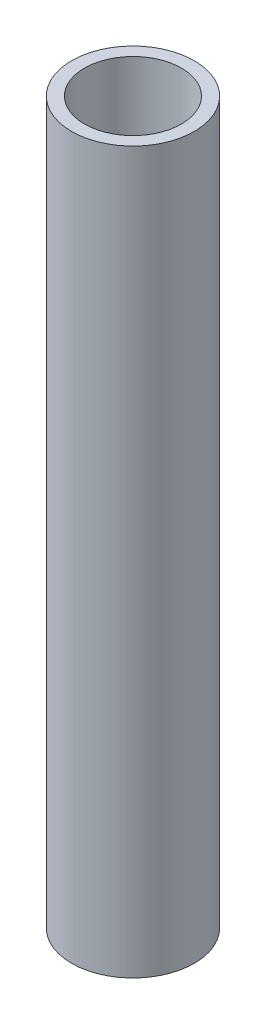
ISO-10303-21;
HEADER;
FILE_DESCRIPTION(('STEP AP214'),'2;1');
FILE_NAME('part.step','',(''),(''),'','','');
FILE_SCHEMA(('AUTOMOTIVE_DESIGN { 1 0 10303 214 1 1 1 1 }'));
ENDSEC;
DATA;
#1=APPLICATION_CONTEXT('core data for automotive mechanical design processes');
#2=APPLICATION_PROTOCOL_DEFINITION('international standard','automotive_design',2000,#1);
#3=PRODUCT_CONTEXT('',#1,'mechanical');
#4=PRODUCT('Part','Part','',(#3));
#5=PRODUCT_RELATED_PRODUCT_CATEGORY('part','',(#4));
#6=PRODUCT_DEFINITION_FORMATION('','',#4);
#7=PRODUCT_DEFINITION_CONTEXT('part definition',#1,'design');
#8=PRODUCT_DEFINITION('design','',#6,#7);
#9=PRODUCT_DEFINITION_SHAPE('','',#8);
#10=(LENGTH_UNIT() NAMED_UNIT(*) SI_UNIT(.MILLI.,.METRE.));
#11=(NAMED_UNIT(*) PLANE_ANGLE_UNIT() SI_UNIT($,.RADIAN.));
#12=(NAMED_UNIT(*) SI_UNIT($,.STERADIAN.) SOLID_ANGLE_UNIT());
#13=UNCERTAINTY_MEASURE_WITH_UNIT(LENGTH_MEASURE(1.E-05),#10,'distance_accuracy_value','');
#14=(GEOMETRIC_REPRESENTATION_CONTEXT(3) GLOBAL_UNCERTAINTY_ASSIGNED_CONTEXT((#13)) GLOBAL_UNIT_ASSIGNED_CONTEXT((#10,
#11,#12)) REPRESENTATION_CONTEXT('',''));
#15=CARTESIAN_POINT('',(0.,0.,0.));
#16=DIRECTION('',(0.,0.,1.));
#17=DIRECTION('',(1.,0.,0.));
#18=AXIS2_PLACEMENT_3D('',#15,#16,#17);
#19=CARTESIAN_POINT('',(0.,20.,0.));
#20=DIRECTION('',(0.,1.,0.));
#21=DIRECTION('',(0.,0.,1.));
#22=AXIS2_PLACEMENT_3D('',#19,#20,#21);
#23=PLANE('',#22);
#24=CARTESIAN_POINT('',(0.,20.,0.));
#25=DIRECTION('',(0.,1.,0.));
#26=DIRECTION('',(0.,0.,1.));
#27=AXIS2_PLACEMENT_3D('',#24,#25,#26);
#28=CIRCLE('',#27,1.702);
#29=CARTESIAN_POINT('',(0.,20.,1.702));
#30=VERTEX_POINT('',#29);
#31=EDGE_CURVE('E10',#30,#30,#28,.T.);
#32=ORIENTED_EDGE('',*,*,#31,.T.);
#33=EDGE_LOOP('',(#32));
#34=FACE_BOUND('',#33,.T.);
#35=CARTESIAN_POINT('',(0.,20.,0.));
#36=DIRECTION('',(0.,1.,0.));
#37=DIRECTION('',(0.,0.,1.));
#38=AXIS2_PLACEMENT_3D('',#35,#36,#37);
#39=CIRCLE('',#38,1.346);
#40=CARTESIAN_POINT('',(0.,20.,1.346));
#41=VERTEX_POINT('',#40);
#42=EDGE_CURVE('E42',#41,#41,#39,.T.);
#43=ORIENTED_EDGE('',*,*,#42,.F.);
#44=EDGE_LOOP('',(#43));
#45=FACE_BOUND('',#44,.T.);
#46=ADVANCED_FACE('F31',(#34,#45),#23,.T.);
#47=CARTESIAN_POINT('',(0.,0.,0.));
#48=DIRECTION('',(0.,1.,0.));
#49=DIRECTION('',(0.,0.,1.));
#50=AXIS2_PLACEMENT_3D('',#47,#48,#49);
#51=PLANE('',#50);
#52=CARTESIAN_POINT('',(0.,0.,0.));
#53=DIRECTION('',(0.,1.,0.));
#54=DIRECTION('',(0.,0.,1.));
#55=AXIS2_PLACEMENT_3D('',#52,#53,#54);
#56=CIRCLE('',#55,1.702);
#57=CARTESIAN_POINT('',(0.,0.,1.702));
#58=VERTEX_POINT('',#57);
#59=EDGE_CURVE('E35',#58,#58,#56,.T.);
#60=ORIENTED_EDGE('',*,*,#59,.F.);
#61=EDGE_LOOP('',(#60));
#62=FACE_BOUND('',#61,.T.);
#63=CARTESIAN_POINT('',(0.,0.,0.));
#64=DIRECTION('',(0.,1.,0.));
#65=DIRECTION('',(0.,0.,1.));
#66=AXIS2_PLACEMENT_3D('',#63,#64,#65);
#67=CIRCLE('',#66,1.346);
#68=CARTESIAN_POINT('',(0.,0.,1.346));
#69=VERTEX_POINT('',#68);
#70=EDGE_CURVE('E44',#69,#69,#67,.T.);
#71=ORIENTED_EDGE('',*,*,#70,.T.);
#72=EDGE_LOOP('',(#71));
#73=FACE_BOUND('',#72,.T.);
#74=ADVANCED_FACE('F54',(#62,#73),#51,.F.);
#75=CARTESIAN_POINT('',(0.,20.,0.));
#76=DIRECTION('',(0.,-1.,0.));
#77=DIRECTION('',(0.,0.,-1.));
#78=AXIS2_PLACEMENT_3D('',#75,#76,#77);
#79=CYLINDRICAL_SURFACE('',#78,1.702);
#80=ORIENTED_EDGE('',*,*,#31,.F.);
#81=EDGE_LOOP('',(#80));
#82=FACE_BOUND('',#81,.T.);
#83=ORIENTED_EDGE('',*,*,#59,.T.);
#84=EDGE_LOOP('',(#83));
#85=FACE_BOUND('',#84,.T.);
#86=ADVANCED_FACE('F33',(#82,#85),#79,.T.);
#87=CARTESIAN_POINT('',(0.,20.,0.));
#88=DIRECTION('',(0.,-1.,0.));
#89=DIRECTION('',(0.,0.,-1.));
#90=AXIS2_PLACEMENT_3D('',#87,#88,#89);
#91=CYLINDRICAL_SURFACE('',#90,1.346);
#92=ORIENTED_EDGE('',*,*,#42,.T.);
#93=EDGE_LOOP('',(#92));
#94=FACE_BOUND('',#93,.T.);
#95=ORIENTED_EDGE('',*,*,#70,.F.);
#96=EDGE_LOOP('',(#95));
#97=FACE_BOUND('',#96,.T.);
#98=ADVANCED_FACE('F50',(#94,#97),#91,.F.);
#99=CLOSED_SHELL('',(#46,#74,#86,#98));
#100=MANIFOLD_SOLID_BREP('B2',#99);
#101=ADVANCED_BREP_SHAPE_REPRESENTATION('',(#18,#100),#14);
#102=SHAPE_DEFINITION_REPRESENTATION(#9,#101);
ENDSEC;
END-ISO-10303-21;
